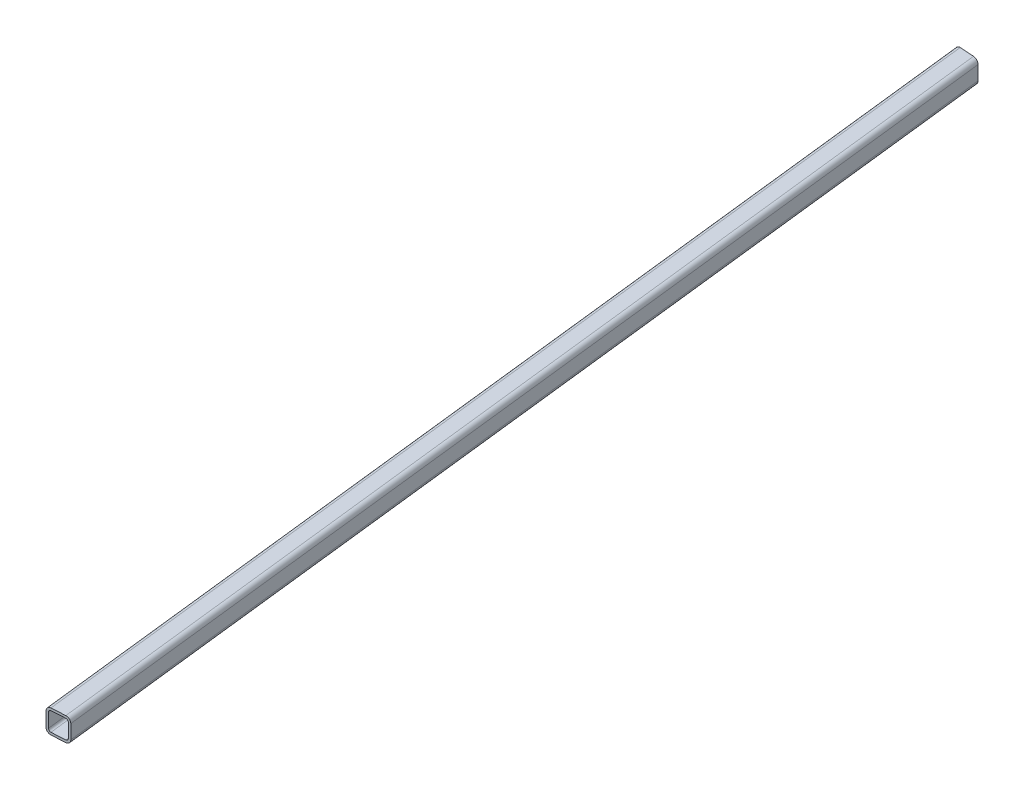
ISO-10303-21;
HEADER;
FILE_DESCRIPTION(('STEP AP214'),'2;1');
FILE_NAME('part.step','',(''),(''),'','','');
FILE_SCHEMA(('AUTOMOTIVE_DESIGN { 1 0 10303 214 1 1 1 1 }'));
ENDSEC;
DATA;
#1=APPLICATION_CONTEXT('core data for automotive mechanical design processes');
#2=APPLICATION_PROTOCOL_DEFINITION('international standard','automotive_design',2000,#1);
#3=PRODUCT_CONTEXT('',#1,'mechanical');
#4=PRODUCT('Part','Part','',(#3));
#5=PRODUCT_RELATED_PRODUCT_CATEGORY('part','',(#4));
#6=PRODUCT_DEFINITION_FORMATION('','',#4);
#7=PRODUCT_DEFINITION_CONTEXT('part definition',#1,'design');
#8=PRODUCT_DEFINITION('design','',#6,#7);
#9=PRODUCT_DEFINITION_SHAPE('','',#8);
#10=(LENGTH_UNIT() NAMED_UNIT(*) SI_UNIT(.MILLI.,.METRE.));
#11=(NAMED_UNIT(*) PLANE_ANGLE_UNIT() SI_UNIT($,.RADIAN.));
#12=(NAMED_UNIT(*) SI_UNIT($,.STERADIAN.) SOLID_ANGLE_UNIT());
#13=UNCERTAINTY_MEASURE_WITH_UNIT(LENGTH_MEASURE(1.E-05),#10,'distance_accuracy_value','');
#14=(GEOMETRIC_REPRESENTATION_CONTEXT(3) GLOBAL_UNCERTAINTY_ASSIGNED_CONTEXT((#13)) GLOBAL_UNIT_ASSIGNED_CONTEXT((#10,
#11,#12)) REPRESENTATION_CONTEXT('',''));
#15=CARTESIAN_POINT('',(0.,0.,0.));
#16=DIRECTION('',(0.,0.,1.));
#17=DIRECTION('',(1.,0.,0.));
#18=AXIS2_PLACEMENT_3D('',#15,#16,#17);
#19=CARTESIAN_POINT('',(-255.961196035939,6.00000000000001,-1699.31872045304));
#20=DIRECTION('',(0.113546591160732,0.,0.993532672656404));
#21=DIRECTION('',(0.993532672656404,0.,-0.113546591160732));
#22=AXIS2_PLACEMENT_3D('',#19,#20,#21);
#23=CYLINDRICAL_SURFACE('',#22,4.);
#24=CARTESIAN_POINT('',(-156.,6.00000000000001,-824.658255138574));
#25=DIRECTION('',(0.056865311674147,0.,0.998381858973911));
#26=DIRECTION('',(0.998381858973911,0.,-0.056865311674147));
#27=AXIS2_PLACEMENT_3D('',#24,#25,#26);
#28=ELLIPSE('',#27,4.00648305460098,4.);
#29=CARTESIAN_POINT('',(-156.,10.,-824.658255138574));
#30=VERTEX_POINT('',#29);
#31=CARTESIAN_POINT('',(-160.,6.00000000000001,-824.430425230957));
#32=VERTEX_POINT('',#31);
#33=EDGE_CURVE('E185',#30,#32,#28,.T.);
#34=ORIENTED_EDGE('',*,*,#33,.F.);
#35=DIRECTION('',(0.113546591160732,0.,0.993532672656404));
#36=VECTOR('',#35,1.);
#37=CARTESIAN_POINT('',(-255.961196035939,10.,-1699.31872045304));
#38=LINE('',#37,#36);
#39=CARTESIAN_POINT('',(-256.084735577657,10.,-1700.39969144308));
#40=VERTEX_POINT('',#39);
#41=EDGE_CURVE('E265',#40,#30,#38,.T.);
#42=ORIENTED_EDGE('',*,*,#41,.F.);
#43=CARTESIAN_POINT('',(-256.084735577657,6.00000000000001,-1700.39969144308));
#44=DIRECTION('',(0.0655463023942974,0.,-0.997849528858152));
#45=DIRECTION('',(0.997849528858152,0.,0.0655463023942974));
#46=AXIS2_PLACEMENT_3D('',#43,#44,#45);
#47=ELLIPSE('',#46,4.06523255038944,4.);
#48=CARTESIAN_POINT('',(-260.141225962762,6.00000000000001,-1700.66615240513));
#49=VERTEX_POINT('',#48);
#50=EDGE_CURVE('E176',#49,#40,#47,.T.);
#51=ORIENTED_EDGE('',*,*,#50,.F.);
#52=DIRECTION('',(0.113546591160732,0.,0.993532672656404));
#53=VECTOR('',#52,1.);
#54=CARTESIAN_POINT('',(-259.935326726564,6.00000000000001,-1698.86453408839));
#55=LINE('',#54,#53);
#56=EDGE_CURVE('E45',#49,#32,#55,.T.);
#57=ORIENTED_EDGE('',*,*,#56,.T.);
#58=EDGE_LOOP('',(#34,#42,#51,#57));
#59=FACE_BOUND('',#58,.T.);
#60=ADVANCED_FACE('F41',(#59),#23,.T.);
#61=CARTESIAN_POINT('',(-255.961196035939,10.,-1699.31872045304));
#62=DIRECTION('',(0.,-1.,0.));
#63=DIRECTION('',(0.,0.,-1.));
#64=AXIS2_PLACEMENT_3D('',#61,#62,#63);
#65=PLANE('',#64);
#66=DIRECTION('',(-0.998381858973911,0.,0.056865311674147));
#67=VECTOR('',#66,1.);
#68=CARTESIAN_POINT('',(-205.980598017969,10.,-821.811486381304));
#69=LINE('',#68,#67);
#70=CARTESIAN_POINT('',(-144.,10.,-825.341744861426));
#71=VERTEX_POINT('',#70);
#72=EDGE_CURVE('E182',#71,#30,#69,.T.);
#73=ORIENTED_EDGE('',*,*,#72,.F.);
#74=DIRECTION('',(0.113546591160732,0.,0.993532672656404));
#75=VECTOR('',#74,1.);
#76=CARTESIAN_POINT('',(-244.038803964062,10.,-1700.68127954697));
#77=LINE('',#76,#75);
#78=CARTESIAN_POINT('',(-243.915264422343,10.,-1699.60030855692));
#79=VERTEX_POINT('',#78);
#80=EDGE_CURVE('E263',#79,#71,#77,.T.);
#81=ORIENTED_EDGE('',*,*,#80,.F.);
#82=DIRECTION('',(0.997849528858152,0.,0.0655463023942974));
#83=VECTOR('',#82,1.);
#84=CARTESIAN_POINT('',(-255.891025518405,10.,-1700.38696710163));
#85=LINE('',#84,#83);
#86=EDGE_CURVE('E281',#40,#79,#85,.T.);
#87=ORIENTED_EDGE('',*,*,#86,.F.);
#88=ORIENTED_EDGE('',*,*,#41,.T.);
#89=EDGE_LOOP('',(#73,#81,#87,#88));
#90=FACE_BOUND('',#89,.T.);
#91=ADVANCED_FACE('F272',(#90),#65,.F.);
#92=CARTESIAN_POINT('',(-244.038803964062,6.00000000000001,-1700.68127954697));
#93=DIRECTION('',(0.113546591160732,0.,0.993532672656404));
#94=DIRECTION('',(0.993532672656404,0.,-0.113546591160732));
#95=AXIS2_PLACEMENT_3D('',#92,#93,#94);
#96=CYLINDRICAL_SURFACE('',#95,4.);
#97=CARTESIAN_POINT('',(-144.,6.00000000000001,-825.341744861426));
#98=DIRECTION('',(0.056865311674147,0.,0.998381858973911));
#99=DIRECTION('',(0.998381858973911,0.,-0.056865311674147));
#100=AXIS2_PLACEMENT_3D('',#97,#98,#99);
#101=ELLIPSE('',#100,4.00648305460098,4.);
#102=CARTESIAN_POINT('',(-140.,6.00000000000001,-825.569574769042));
#103=VERTEX_POINT('',#102);
#104=EDGE_CURVE('E11',#103,#71,#101,.T.);
#105=ORIENTED_EDGE('',*,*,#104,.F.);
#106=DIRECTION('',(0.113546591160732,0.,0.993532672656404));
#107=VECTOR('',#106,1.);
#108=CARTESIAN_POINT('',(-240.064673273436,6.00000000000001,-1701.13546591161));
#109=LINE('',#108,#107);
#110=CARTESIAN_POINT('',(-239.858774037238,6.00000000000001,-1699.33384759487));
#111=VERTEX_POINT('',#110);
#112=EDGE_CURVE('E260',#111,#103,#109,.T.);
#113=ORIENTED_EDGE('',*,*,#112,.F.);
#114=CARTESIAN_POINT('',(-243.915264422343,6.00000000000001,-1699.60030855692));
#115=DIRECTION('',(0.0655463023942974,0.,-0.997849528858152));
#116=DIRECTION('',(0.997849528858152,0.,0.0655463023942974));
#117=AXIS2_PLACEMENT_3D('',#114,#115,#116);
#118=ELLIPSE('',#117,4.06523255038944,4.);
#119=EDGE_CURVE('E278',#79,#111,#118,.T.);
#120=ORIENTED_EDGE('',*,*,#119,.F.);
#121=ORIENTED_EDGE('',*,*,#80,.T.);
#122=EDGE_LOOP('',(#105,#113,#120,#121));
#123=FACE_BOUND('',#122,.T.);
#124=ADVANCED_FACE('F275',(#123),#96,.T.);
#125=CARTESIAN_POINT('',(-240.064673273436,-6.00000000000001,-1701.13546591161));
#126=DIRECTION('',(-0.993532672656404,0.,0.113546591160732));
#127=DIRECTION('',(0.113546591160732,0.,0.993532672656404));
#128=AXIS2_PLACEMENT_3D('',#125,#126,#127);
#129=PLANE('',#128);
#130=DIRECTION('',(0.,1.,0.));
#131=VECTOR('',#130,1.);
#132=CARTESIAN_POINT('',(-140.,-6.00000000000001,-825.569574769043));
#133=LINE('',#132,#131);
#134=CARTESIAN_POINT('',(-140.,-6.00000000000001,-825.569574769043));
#135=VERTEX_POINT('',#134);
#136=EDGE_CURVE('E51',#135,#103,#133,.T.);
#137=ORIENTED_EDGE('',*,*,#136,.F.);
#138=DIRECTION('',(0.113546591160732,0.,0.993532672656404));
#139=VECTOR('',#138,1.);
#140=CARTESIAN_POINT('',(-240.064673273436,-6.00000000000001,-1701.13546591161));
#141=LINE('',#140,#139);
#142=CARTESIAN_POINT('',(-239.858774037238,-6.00000000000001,-1699.33384759487));
#143=VERTEX_POINT('',#142);
#144=EDGE_CURVE('E257',#143,#135,#141,.T.);
#145=ORIENTED_EDGE('',*,*,#144,.F.);
#146=DIRECTION('',(0.,-1.,0.));
#147=VECTOR('',#146,1.);
#148=CARTESIAN_POINT('',(-239.858774037238,-6.00000000000001,-1699.33384759487));
#149=LINE('',#148,#147);
#150=EDGE_CURVE('E280',#111,#143,#149,.T.);
#151=ORIENTED_EDGE('',*,*,#150,.F.);
#152=ORIENTED_EDGE('',*,*,#112,.T.);
#153=EDGE_LOOP('',(#137,#145,#151,#152));
#154=FACE_BOUND('',#153,.T.);
#155=ADVANCED_FACE('F291',(#154),#129,.F.);
#156=CARTESIAN_POINT('',(-244.038803964062,-6.00000000000001,-1700.68127954697));
#157=DIRECTION('',(0.113546591160732,0.,0.993532672656404));
#158=DIRECTION('',(0.993532672656404,0.,-0.113546591160732));
#159=AXIS2_PLACEMENT_3D('',#156,#157,#158);
#160=CYLINDRICAL_SURFACE('',#159,4.);
#161=CARTESIAN_POINT('',(-144.,-6.00000000000001,-825.341744861426));
#162=DIRECTION('',(0.056865311674147,0.,0.998381858973911));
#163=DIRECTION('',(0.998381858973911,0.,-0.056865311674147));
#164=AXIS2_PLACEMENT_3D('',#161,#162,#163);
#165=ELLIPSE('',#164,4.00648305460098,4.);
#166=CARTESIAN_POINT('',(-144.,-10.,-825.341744861426));
#167=VERTEX_POINT('',#166);
#168=EDGE_CURVE('E200',#167,#135,#165,.T.);
#169=ORIENTED_EDGE('',*,*,#168,.F.);
#170=DIRECTION('',(0.113546591160732,0.,0.993532672656404));
#171=VECTOR('',#170,1.);
#172=CARTESIAN_POINT('',(-244.038803964062,-10.,-1700.68127954697));
#173=LINE('',#172,#171);
#174=CARTESIAN_POINT('',(-243.915264422343,-10.,-1699.60030855692));
#175=VERTEX_POINT('',#174);
#176=EDGE_CURVE('E254',#175,#167,#173,.T.);
#177=ORIENTED_EDGE('',*,*,#176,.F.);
#178=CARTESIAN_POINT('',(-243.915264422343,-6.00000000000001,-1699.60030855692));
#179=DIRECTION('',(0.0655463023942974,0.,-0.997849528858152));
#180=DIRECTION('',(0.997849528858152,0.,0.0655463023942974));
#181=AXIS2_PLACEMENT_3D('',#178,#179,#180);
#182=ELLIPSE('',#181,4.06523255038944,4.);
#183=EDGE_CURVE('E187',#143,#175,#182,.T.);
#184=ORIENTED_EDGE('',*,*,#183,.F.);
#185=ORIENTED_EDGE('',*,*,#144,.T.);
#186=EDGE_LOOP('',(#169,#177,#184,#185));
#187=FACE_BOUND('',#186,.T.);
#188=ADVANCED_FACE('F289',(#187),#160,.T.);
#189=CARTESIAN_POINT('',(-244.038803964062,-10.,-1700.68127954697));
#190=DIRECTION('',(0.,1.,0.));
#191=DIRECTION('',(0.,0.,1.));
#192=AXIS2_PLACEMENT_3D('',#189,#190,#191);
#193=PLANE('',#192);
#194=DIRECTION('',(0.998381858973911,0.,-0.056865311674147));
#195=VECTOR('',#194,1.);
#196=CARTESIAN_POINT('',(-194.019401982031,-10.,-822.492765928269));
#197=LINE('',#196,#195);
#198=CARTESIAN_POINT('',(-156.,-10.,-824.658255138574));
#199=VERTEX_POINT('',#198);
#200=EDGE_CURVE('E203',#199,#167,#197,.T.);
#201=ORIENTED_EDGE('',*,*,#200,.F.);
#202=DIRECTION('',(0.113546591160732,0.,0.993532672656404));
#203=VECTOR('',#202,1.);
#204=CARTESIAN_POINT('',(-255.961196035939,-10.,-1699.31872045304));
#205=LINE('',#204,#203);
#206=CARTESIAN_POINT('',(-256.084735577657,-10.,-1700.39969144308));
#207=VERTEX_POINT('',#206);
#208=EDGE_CURVE('E252',#207,#199,#205,.T.);
#209=ORIENTED_EDGE('',*,*,#208,.F.);
#210=DIRECTION('',(-0.997849528858152,0.,-0.0655463023942974));
#211=VECTOR('',#210,1.);
#212=CARTESIAN_POINT('',(-244.108974481595,-10.,-1699.61303289837));
#213=LINE('',#212,#211);
#214=EDGE_CURVE('E181',#175,#207,#213,.T.);
#215=ORIENTED_EDGE('',*,*,#214,.F.);
#216=ORIENTED_EDGE('',*,*,#176,.T.);
#217=EDGE_LOOP('',(#201,#209,#215,#216));
#218=FACE_BOUND('',#217,.T.);
#219=ADVANCED_FACE('F293',(#218),#193,.F.);
#220=CARTESIAN_POINT('',(-255.961196035939,-6.00000000000001,-1699.31872045304));
#221=DIRECTION('',(0.113546591160732,0.,0.993532672656404));
#222=DIRECTION('',(0.993532672656404,0.,-0.113546591160732));
#223=AXIS2_PLACEMENT_3D('',#220,#221,#222);
#224=CYLINDRICAL_SURFACE('',#223,4.);
#225=CARTESIAN_POINT('',(-156.,-6.00000000000001,-824.658255138574));
#226=DIRECTION('',(0.056865311674147,0.,0.998381858973911));
#227=DIRECTION('',(0.998381858973911,0.,-0.056865311674147));
#228=AXIS2_PLACEMENT_3D('',#225,#226,#227);
#229=ELLIPSE('',#228,4.00648305460098,4.);
#230=CARTESIAN_POINT('',(-160.,-6.00000000000001,-824.430425230957));
#231=VERTEX_POINT('',#230);
#232=EDGE_CURVE('E164',#231,#199,#229,.T.);
#233=ORIENTED_EDGE('',*,*,#232,.F.);
#234=DIRECTION('',(0.113546591160732,0.,0.993532672656404));
#235=VECTOR('',#234,1.);
#236=CARTESIAN_POINT('',(-259.935326726564,-6.00000000000001,-1698.86453408839));
#237=LINE('',#236,#235);
#238=CARTESIAN_POINT('',(-260.141225962762,-6.00000000000001,-1700.66615240513));
#239=VERTEX_POINT('',#238);
#240=EDGE_CURVE('E156',#239,#231,#237,.T.);
#241=ORIENTED_EDGE('',*,*,#240,.F.);
#242=CARTESIAN_POINT('',(-256.084735577657,-6.00000000000001,-1700.39969144308));
#243=DIRECTION('',(0.0655463023942974,0.,-0.997849528858152));
#244=DIRECTION('',(0.997849528858152,0.,0.0655463023942974));
#245=AXIS2_PLACEMENT_3D('',#242,#243,#244);
#246=ELLIPSE('',#245,4.06523255038944,4.);
#247=EDGE_CURVE('E161',#207,#239,#246,.T.);
#248=ORIENTED_EDGE('',*,*,#247,.F.);
#249=ORIENTED_EDGE('',*,*,#208,.T.);
#250=EDGE_LOOP('',(#233,#241,#248,#249));
#251=FACE_BOUND('',#250,.T.);
#252=ADVANCED_FACE('F158',(#251),#224,.T.);
#253=CARTESIAN_POINT('',(-244.038803964062,6.00000000000001,-1700.68127954697));
#254=DIRECTION('',(0.113546591160732,0.,0.993532672656404));
#255=DIRECTION('',(0.993532672656404,0.,-0.113546591160732));
#256=AXIS2_PLACEMENT_3D('',#253,#254,#255);
#257=CYLINDRICAL_SURFACE('',#256,2.);
#258=DIRECTION('',(0.113546591160732,0.,0.993532672656404));
#259=VECTOR('',#258,1.);
#260=CARTESIAN_POINT('',(-242.051738618749,6.00000000000001,-1700.90837272929));
#261=LINE('',#260,#259);
#262=CARTESIAN_POINT('',(-241.88701922979,6.00000000000001,-1699.4670780759));
#263=VERTEX_POINT('',#262);
#264=CARTESIAN_POINT('',(-142.,6.00000000000001,-825.455659815234));
#265=VERTEX_POINT('',#264);
#266=EDGE_CURVE('E209',#263,#265,#261,.T.);
#267=ORIENTED_EDGE('',*,*,#266,.T.);
#268=CARTESIAN_POINT('',(-144.,6.00000000000001,-825.341744861426));
#269=DIRECTION('',(0.056865311674147,0.,0.998381858973911));
#270=DIRECTION('',(0.998381858973911,0.,-0.056865311674147));
#271=AXIS2_PLACEMENT_3D('',#268,#269,#270);
#272=ELLIPSE('',#271,2.00324152730049,2.);
#273=CARTESIAN_POINT('',(-144.,8.00000000000001,-825.341744861426));
#274=VERTEX_POINT('',#273);
#275=EDGE_CURVE('E87',#265,#274,#272,.T.);
#276=ORIENTED_EDGE('',*,*,#275,.T.);
#277=DIRECTION('',(0.113546591160732,0.,0.993532672656404));
#278=VECTOR('',#277,1.);
#279=CARTESIAN_POINT('',(-244.038803964062,8.00000000000001,-1700.68127954697));
#280=LINE('',#279,#278);
#281=CARTESIAN_POINT('',(-243.915264422343,8.00000000000001,-1699.60030855692));
#282=VERTEX_POINT('',#281);
#283=EDGE_CURVE('E212',#282,#274,#280,.T.);
#284=ORIENTED_EDGE('',*,*,#283,.F.);
#285=CARTESIAN_POINT('',(-243.915264422343,6.00000000000001,-1699.60030855692));
#286=DIRECTION('',(0.0655463023942974,0.,-0.997849528858152));
#287=DIRECTION('',(0.997849528858152,0.,0.0655463023942974));
#288=AXIS2_PLACEMENT_3D('',#285,#286,#287);
#289=ELLIPSE('',#288,2.03261627519472,2.);
#290=EDGE_CURVE('E208',#282,#263,#289,.T.);
#291=ORIENTED_EDGE('',*,*,#290,.T.);
#292=EDGE_LOOP('',(#267,#276,#284,#291));
#293=FACE_BOUND('',#292,.T.);
#294=ADVANCED_FACE('F301',(#293),#257,.F.);
#295=CARTESIAN_POINT('',(-255.961196035939,8.00000000000001,-1699.31872045304));
#296=DIRECTION('',(0.,-1.,0.));
#297=DIRECTION('',(0.,0.,-1.));
#298=AXIS2_PLACEMENT_3D('',#295,#296,#297);
#299=PLANE('',#298);
#300=ORIENTED_EDGE('',*,*,#283,.T.);
#301=DIRECTION('',(-0.998381858973911,0.,0.056865311674147));
#302=VECTOR('',#301,1.);
#303=CARTESIAN_POINT('',(-205.980598017969,8.00000000000001,-821.811486381304));
#304=LINE('',#303,#302);
#305=CARTESIAN_POINT('',(-156.,8.00000000000001,-824.658255138574));
#306=VERTEX_POINT('',#305);
#307=EDGE_CURVE('E60',#274,#306,#304,.T.);
#308=ORIENTED_EDGE('',*,*,#307,.T.);
#309=DIRECTION('',(0.113546591160732,0.,0.993532672656404));
#310=VECTOR('',#309,1.);
#311=CARTESIAN_POINT('',(-255.961196035939,8.00000000000001,-1699.31872045304));
#312=LINE('',#311,#310);
#313=CARTESIAN_POINT('',(-256.084735577657,8.00000000000001,-1700.39969144308));
#314=VERTEX_POINT('',#313);
#315=EDGE_CURVE('E217',#314,#306,#312,.T.);
#316=ORIENTED_EDGE('',*,*,#315,.F.);
#317=DIRECTION('',(0.997849528858152,0.,0.0655463023942974));
#318=VECTOR('',#317,1.);
#319=CARTESIAN_POINT('',(-255.891025518405,8.00000000000001,-1700.38696710163));
#320=LINE('',#319,#318);
#321=EDGE_CURVE('E211',#314,#282,#320,.T.);
#322=ORIENTED_EDGE('',*,*,#321,.T.);
#323=EDGE_LOOP('',(#300,#308,#316,#322));
#324=FACE_BOUND('',#323,.T.);
#325=ADVANCED_FACE('F349',(#324),#299,.T.);
#326=CARTESIAN_POINT('',(-255.961196035939,6.00000000000001,-1699.31872045304));
#327=DIRECTION('',(0.113546591160732,0.,0.993532672656404));
#328=DIRECTION('',(0.993532672656404,0.,-0.113546591160732));
#329=AXIS2_PLACEMENT_3D('',#326,#327,#328);
#330=CYLINDRICAL_SURFACE('',#329,2.);
#331=ORIENTED_EDGE('',*,*,#315,.T.);
#332=CARTESIAN_POINT('',(-156.,6.00000000000001,-824.658255138574));
#333=DIRECTION('',(0.056865311674147,0.,0.998381858973911));
#334=DIRECTION('',(0.998381858973911,0.,-0.056865311674147));
#335=AXIS2_PLACEMENT_3D('',#332,#333,#334);
#336=ELLIPSE('',#335,2.00324152730049,2.);
#337=CARTESIAN_POINT('',(-158.,6.00000000000001,-824.544340184766));
#338=VERTEX_POINT('',#337);
#339=EDGE_CURVE('E213',#306,#338,#336,.T.);
#340=ORIENTED_EDGE('',*,*,#339,.T.);
#341=DIRECTION('',(0.113546591160732,0.,0.993532672656404));
#342=VECTOR('',#341,1.);
#343=CARTESIAN_POINT('',(-257.948261381251,6.00000000000001,-1699.09162727071));
#344=LINE('',#343,#342);
#345=CARTESIAN_POINT('',(-258.11298077021,6.00000000000001,-1700.5329219241));
#346=VERTEX_POINT('',#345);
#347=EDGE_CURVE('E222',#346,#338,#344,.T.);
#348=ORIENTED_EDGE('',*,*,#347,.F.);
#349=CARTESIAN_POINT('',(-256.084735577657,6.00000000000001,-1700.39969144308));
#350=DIRECTION('',(0.0655463023942974,0.,-0.997849528858152));
#351=DIRECTION('',(0.997849528858152,0.,0.0655463023942974));
#352=AXIS2_PLACEMENT_3D('',#349,#350,#351);
#353=ELLIPSE('',#352,2.03261627519472,2.);
#354=EDGE_CURVE('E216',#346,#314,#353,.T.);
#355=ORIENTED_EDGE('',*,*,#354,.T.);
#356=EDGE_LOOP('',(#331,#340,#348,#355));
#357=FACE_BOUND('',#356,.T.);
#358=ADVANCED_FACE('F357',(#357),#330,.F.);
#359=CARTESIAN_POINT('',(-257.948261381251,6.00000000000001,-1699.09162727071));
#360=DIRECTION('',(0.993532672656404,0.,-0.113546591160732));
#361=DIRECTION('',(-0.113546591160732,0.,-0.993532672656404));
#362=AXIS2_PLACEMENT_3D('',#359,#360,#361);
#363=PLANE('',#362);
#364=ORIENTED_EDGE('',*,*,#347,.T.);
#365=DIRECTION('',(0.,-1.,0.));
#366=VECTOR('',#365,1.);
#367=CARTESIAN_POINT('',(-158.,6.00000000000001,-824.544340184766));
#368=LINE('',#367,#366);
#369=CARTESIAN_POINT('',(-158.,-6.00000000000001,-824.544340184766));
#370=VERTEX_POINT('',#369);
#371=EDGE_CURVE('E218',#338,#370,#368,.T.);
#372=ORIENTED_EDGE('',*,*,#371,.T.);
#373=DIRECTION('',(0.113546591160732,0.,0.993532672656404));
#374=VECTOR('',#373,1.);
#375=CARTESIAN_POINT('',(-257.948261381251,-6.00000000000001,-1699.09162727071));
#376=LINE('',#375,#374);
#377=CARTESIAN_POINT('',(-258.11298077021,-6.00000000000001,-1700.5329219241));
#378=VERTEX_POINT('',#377);
#379=EDGE_CURVE('E227',#378,#370,#376,.T.);
#380=ORIENTED_EDGE('',*,*,#379,.F.);
#381=DIRECTION('',(0.,1.,0.));
#382=VECTOR('',#381,1.);
#383=CARTESIAN_POINT('',(-258.11298077021,6.00000000000001,-1700.5329219241));
#384=LINE('',#383,#382);
#385=EDGE_CURVE('E221',#378,#346,#384,.T.);
#386=ORIENTED_EDGE('',*,*,#385,.T.);
#387=EDGE_LOOP('',(#364,#372,#380,#386));
#388=FACE_BOUND('',#387,.T.);
#389=ADVANCED_FACE('F365',(#388),#363,.T.);
#390=CARTESIAN_POINT('',(-255.961196035939,-6.00000000000001,-1699.31872045304));
#391=DIRECTION('',(0.113546591160732,0.,0.993532672656404));
#392=DIRECTION('',(0.993532672656404,0.,-0.113546591160732));
#393=AXIS2_PLACEMENT_3D('',#390,#391,#392);
#394=CYLINDRICAL_SURFACE('',#393,2.);
#395=ORIENTED_EDGE('',*,*,#379,.T.);
#396=CARTESIAN_POINT('',(-156.,-6.00000000000001,-824.658255138574));
#397=DIRECTION('',(0.056865311674147,0.,0.998381858973911));
#398=DIRECTION('',(0.998381858973911,0.,-0.056865311674147));
#399=AXIS2_PLACEMENT_3D('',#396,#397,#398);
#400=ELLIPSE('',#399,2.00324152730049,2.);
#401=CARTESIAN_POINT('',(-156.,-8.00000000000001,-824.658255138574));
#402=VERTEX_POINT('',#401);
#403=EDGE_CURVE('E223',#370,#402,#400,.T.);
#404=ORIENTED_EDGE('',*,*,#403,.T.);
#405=DIRECTION('',(0.113546591160732,0.,0.993532672656404));
#406=VECTOR('',#405,1.);
#407=CARTESIAN_POINT('',(-255.961196035939,-8.00000000000001,-1699.31872045304));
#408=LINE('',#407,#406);
#409=CARTESIAN_POINT('',(-256.084735577657,-8.00000000000001,-1700.39969144308));
#410=VERTEX_POINT('',#409);
#411=EDGE_CURVE('E232',#410,#402,#408,.T.);
#412=ORIENTED_EDGE('',*,*,#411,.F.);
#413=CARTESIAN_POINT('',(-256.084735577657,-6.00000000000001,-1700.39969144308));
#414=DIRECTION('',(0.0655463023942974,0.,-0.997849528858152));
#415=DIRECTION('',(0.997849528858152,0.,0.0655463023942974));
#416=AXIS2_PLACEMENT_3D('',#413,#414,#415);
#417=ELLIPSE('',#416,2.03261627519472,2.);
#418=EDGE_CURVE('E226',#410,#378,#417,.T.);
#419=ORIENTED_EDGE('',*,*,#418,.T.);
#420=EDGE_LOOP('',(#395,#404,#412,#419));
#421=FACE_BOUND('',#420,.T.);
#422=ADVANCED_FACE('F373',(#421),#394,.F.);
#423=CARTESIAN_POINT('',(-244.038803964062,-8.00000000000001,-1700.68127954697));
#424=DIRECTION('',(0.,1.,0.));
#425=DIRECTION('',(0.,0.,1.));
#426=AXIS2_PLACEMENT_3D('',#423,#424,#425);
#427=PLANE('',#426);
#428=ORIENTED_EDGE('',*,*,#411,.T.);
#429=DIRECTION('',(0.998381858973911,0.,-0.056865311674147));
#430=VECTOR('',#429,1.);
#431=CARTESIAN_POINT('',(-194.019401982031,-8.00000000000001,-822.492765928269));
#432=LINE('',#431,#430);
#433=CARTESIAN_POINT('',(-144.,-8.00000000000001,-825.341744861426));
#434=VERTEX_POINT('',#433);
#435=EDGE_CURVE('E228',#402,#434,#432,.T.);
#436=ORIENTED_EDGE('',*,*,#435,.T.);
#437=DIRECTION('',(0.113546591160732,0.,0.993532672656404));
#438=VECTOR('',#437,1.);
#439=CARTESIAN_POINT('',(-244.038803964062,-8.00000000000001,-1700.68127954697));
#440=LINE('',#439,#438);
#441=CARTESIAN_POINT('',(-243.915264422343,-8.00000000000001,-1699.60030855692));
#442=VERTEX_POINT('',#441);
#443=EDGE_CURVE('E236',#442,#434,#440,.T.);
#444=ORIENTED_EDGE('',*,*,#443,.F.);
#445=DIRECTION('',(-0.997849528858152,0.,-0.0655463023942974));
#446=VECTOR('',#445,1.);
#447=CARTESIAN_POINT('',(-244.108974481595,-8.00000000000001,-1699.61303289837));
#448=LINE('',#447,#446);
#449=EDGE_CURVE('E231',#442,#410,#448,.T.);
#450=ORIENTED_EDGE('',*,*,#449,.T.);
#451=EDGE_LOOP('',(#428,#436,#444,#450));
#452=FACE_BOUND('',#451,.T.);
#453=ADVANCED_FACE('F381',(#452),#427,.T.);
#454=CARTESIAN_POINT('',(-244.038803964062,-6.00000000000001,-1700.68127954697));
#455=DIRECTION('',(0.113546591160732,0.,0.993532672656404));
#456=DIRECTION('',(0.993532672656404,0.,-0.113546591160732));
#457=AXIS2_PLACEMENT_3D('',#454,#455,#456);
#458=CYLINDRICAL_SURFACE('',#457,2.);
#459=ORIENTED_EDGE('',*,*,#443,.T.);
#460=CARTESIAN_POINT('',(-144.,-6.00000000000001,-825.341744861426));
#461=DIRECTION('',(0.056865311674147,0.,0.998381858973911));
#462=DIRECTION('',(0.998381858973911,0.,-0.056865311674147));
#463=AXIS2_PLACEMENT_3D('',#460,#461,#462);
#464=ELLIPSE('',#463,2.00324152730049,2.);
#465=CARTESIAN_POINT('',(-142.,-6.00000000000001,-825.455659815234));
#466=VERTEX_POINT('',#465);
#467=EDGE_CURVE('E233',#434,#466,#464,.T.);
#468=ORIENTED_EDGE('',*,*,#467,.T.);
#469=DIRECTION('',(0.113546591160732,0.,0.993532672656404));
#470=VECTOR('',#469,1.);
#471=CARTESIAN_POINT('',(-242.051738618749,-6.00000000000001,-1700.90837272929));
#472=LINE('',#471,#470);
#473=CARTESIAN_POINT('',(-241.88701922979,-6.00000000000001,-1699.4670780759));
#474=VERTEX_POINT('',#473);
#475=EDGE_CURVE('E194',#474,#466,#472,.T.);
#476=ORIENTED_EDGE('',*,*,#475,.F.);
#477=CARTESIAN_POINT('',(-243.915264422343,-6.00000000000001,-1699.60030855692));
#478=DIRECTION('',(0.0655463023942974,0.,-0.997849528858152));
#479=DIRECTION('',(0.997849528858152,0.,0.0655463023942974));
#480=AXIS2_PLACEMENT_3D('',#477,#478,#479);
#481=ELLIPSE('',#480,2.03261627519472,2.);
#482=EDGE_CURVE('E235',#474,#442,#481,.T.);
#483=ORIENTED_EDGE('',*,*,#482,.T.);
#484=EDGE_LOOP('',(#459,#468,#476,#483));
#485=FACE_BOUND('',#484,.T.);
#486=ADVANCED_FACE('F389',(#485),#458,.F.);
#487=CARTESIAN_POINT('',(-242.051738618749,-6.00000000000001,-1700.90837272929));
#488=DIRECTION('',(-0.993532672656404,0.,0.113546591160732));
#489=DIRECTION('',(0.113546591160732,0.,0.993532672656404));
#490=AXIS2_PLACEMENT_3D('',#487,#488,#489);
#491=PLANE('',#490);
#492=ORIENTED_EDGE('',*,*,#475,.T.);
#493=DIRECTION('',(0.,1.,0.));
#494=VECTOR('',#493,1.);
#495=CARTESIAN_POINT('',(-142.,-6.00000000000001,-825.455659815234));
#496=LINE('',#495,#494);
#497=EDGE_CURVE('E82',#466,#265,#496,.T.);
#498=ORIENTED_EDGE('',*,*,#497,.T.);
#499=ORIENTED_EDGE('',*,*,#266,.F.);
#500=DIRECTION('',(0.,-1.,0.));
#501=VECTOR('',#500,1.);
#502=CARTESIAN_POINT('',(-241.88701922979,-6.00000000000001,-1699.4670780759));
#503=LINE('',#502,#501);
#504=EDGE_CURVE('E169',#263,#474,#503,.T.);
#505=ORIENTED_EDGE('',*,*,#504,.T.);
#506=EDGE_LOOP('',(#492,#498,#499,#505));
#507=FACE_BOUND('',#506,.T.);
#508=ADVANCED_FACE('F397',(#507),#491,.T.);
#509=CARTESIAN_POINT('',(-259.935326726564,6.00000000000001,-1698.86453408839));
#510=DIRECTION('',(0.993532672656404,0.,-0.113546591160732));
#511=DIRECTION('',(-0.113546591160732,0.,-0.993532672656404));
#512=AXIS2_PLACEMENT_3D('',#509,#510,#511);
#513=PLANE('',#512);
#514=DIRECTION('',(0.,-1.,0.));
#515=VECTOR('',#514,1.);
#516=CARTESIAN_POINT('',(-160.,6.00000000000001,-824.430425230957));
#517=LINE('',#516,#515);
#518=EDGE_CURVE('E196',#32,#231,#517,.T.);
#519=ORIENTED_EDGE('',*,*,#518,.F.);
#520=ORIENTED_EDGE('',*,*,#56,.F.);
#521=DIRECTION('',(0.,1.,0.));
#522=VECTOR('',#521,1.);
#523=CARTESIAN_POINT('',(-260.141225962762,6.00000000000001,-1700.66615240513));
#524=LINE('',#523,#522);
#525=EDGE_CURVE('E168',#239,#49,#524,.T.);
#526=ORIENTED_EDGE('',*,*,#525,.F.);
#527=ORIENTED_EDGE('',*,*,#240,.T.);
#528=EDGE_LOOP('',(#519,#520,#526,#527));
#529=FACE_BOUND('',#528,.T.);
#530=ADVANCED_FACE('F172',(#529),#513,.F.);
#531=CARTESIAN_POINT('',(-250.,0.,-1700.));
#532=DIRECTION('',(0.0655463023942974,0.,-0.997849528858152));
#533=DIRECTION('',(-0.997849528858152,0.,-0.0655463023942974));
#534=AXIS2_PLACEMENT_3D('',#531,#532,#533);
#535=PLANE('',#534);
#536=ORIENTED_EDGE('',*,*,#290,.F.);
#537=ORIENTED_EDGE('',*,*,#321,.F.);
#538=ORIENTED_EDGE('',*,*,#354,.F.);
#539=ORIENTED_EDGE('',*,*,#385,.F.);
#540=ORIENTED_EDGE('',*,*,#418,.F.);
#541=ORIENTED_EDGE('',*,*,#449,.F.);
#542=ORIENTED_EDGE('',*,*,#482,.F.);
#543=ORIENTED_EDGE('',*,*,#504,.F.);
#544=EDGE_LOOP('',(#536,#537,#538,#539,#540,#541,#542,#543));
#545=FACE_BOUND('',#544,.T.);
#546=ORIENTED_EDGE('',*,*,#525,.T.);
#547=ORIENTED_EDGE('',*,*,#50,.T.);
#548=ORIENTED_EDGE('',*,*,#86,.T.);
#549=ORIENTED_EDGE('',*,*,#119,.T.);
#550=ORIENTED_EDGE('',*,*,#150,.T.);
#551=ORIENTED_EDGE('',*,*,#183,.T.);
#552=ORIENTED_EDGE('',*,*,#214,.T.);
#553=ORIENTED_EDGE('',*,*,#247,.T.);
#554=EDGE_LOOP('',(#546,#547,#548,#549,#550,#551,#552,#553));
#555=FACE_BOUND('',#554,.T.);
#556=ADVANCED_FACE('F179',(#545,#555),#535,.T.);
#557=CARTESIAN_POINT('',(-150.,0.,-825.));
#558=DIRECTION('',(0.056865311674147,0.,0.998381858973911));
#559=DIRECTION('',(0.998381858973911,0.,-0.056865311674147));
#560=AXIS2_PLACEMENT_3D('',#557,#558,#559);
#561=PLANE('',#560);
#562=ORIENTED_EDGE('',*,*,#275,.F.);
#563=ORIENTED_EDGE('',*,*,#497,.F.);
#564=ORIENTED_EDGE('',*,*,#467,.F.);
#565=ORIENTED_EDGE('',*,*,#435,.F.);
#566=ORIENTED_EDGE('',*,*,#403,.F.);
#567=ORIENTED_EDGE('',*,*,#371,.F.);
#568=ORIENTED_EDGE('',*,*,#339,.F.);
#569=ORIENTED_EDGE('',*,*,#307,.F.);
#570=EDGE_LOOP('',(#562,#563,#564,#565,#566,#567,#568,#569));
#571=FACE_BOUND('',#570,.T.);
#572=ORIENTED_EDGE('',*,*,#72,.T.);
#573=ORIENTED_EDGE('',*,*,#33,.T.);
#574=ORIENTED_EDGE('',*,*,#518,.T.);
#575=ORIENTED_EDGE('',*,*,#232,.T.);
#576=ORIENTED_EDGE('',*,*,#200,.T.);
#577=ORIENTED_EDGE('',*,*,#168,.T.);
#578=ORIENTED_EDGE('',*,*,#136,.T.);
#579=ORIENTED_EDGE('',*,*,#104,.T.);
#580=EDGE_LOOP('',(#572,#573,#574,#575,#576,#577,#578,#579));
#581=FACE_BOUND('',#580,.T.);
#582=ADVANCED_FACE('F43',(#571,#581),#561,.T.);
#583=CLOSED_SHELL('',(#60,#91,#124,#155,#188,#219,#252,#294,#325,#358,#389,#422,#453,#486,#508,
#530,#556,#582));
#584=MANIFOLD_SOLID_BREP('B2',#583);
#585=ADVANCED_BREP_SHAPE_REPRESENTATION('',(#18,#584),#14);
#586=SHAPE_DEFINITION_REPRESENTATION(#9,#585);
ENDSEC;
END-ISO-10303-21;
